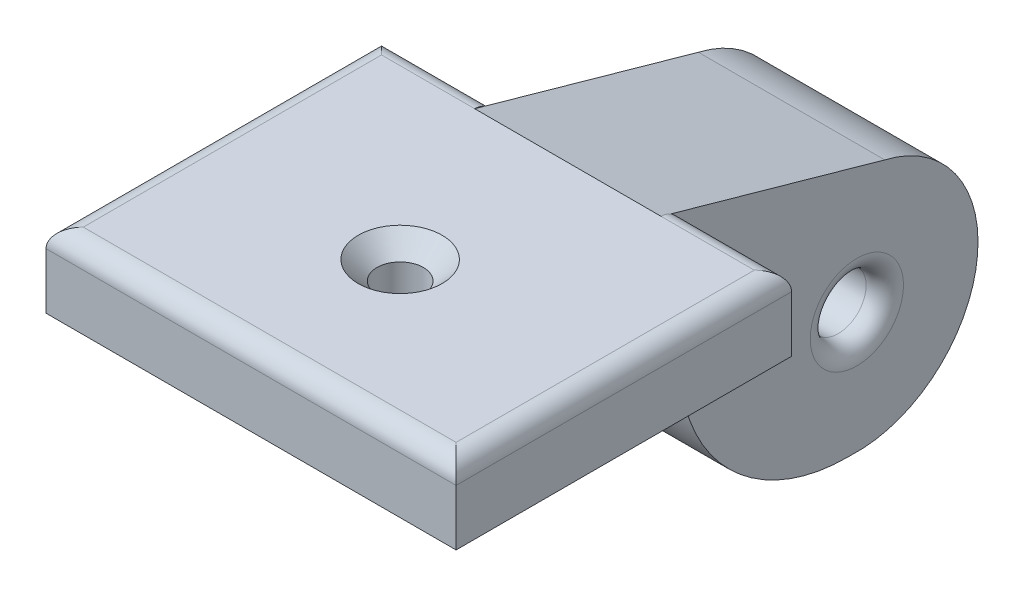
ISO-10303-21;
HEADER;
FILE_DESCRIPTION(('STEP AP214'),'2;1');
FILE_NAME('part.step','',(''),(''),'','','');
FILE_SCHEMA(('AUTOMOTIVE_DESIGN { 1 0 10303 214 1 1 1 1 }'));
ENDSEC;
DATA;
#1=APPLICATION_CONTEXT('core data for automotive mechanical design processes');
#2=APPLICATION_PROTOCOL_DEFINITION('international standard','automotive_design',2000,#1);
#3=PRODUCT_CONTEXT('',#1,'mechanical');
#4=PRODUCT('Part','Part','',(#3));
#5=PRODUCT_RELATED_PRODUCT_CATEGORY('part','',(#4));
#6=PRODUCT_DEFINITION_FORMATION('','',#4);
#7=PRODUCT_DEFINITION_CONTEXT('part definition',#1,'design');
#8=PRODUCT_DEFINITION('design','',#6,#7);
#9=PRODUCT_DEFINITION_SHAPE('','',#8);
#10=(LENGTH_UNIT() NAMED_UNIT(*) SI_UNIT(.MILLI.,.METRE.));
#11=(NAMED_UNIT(*) PLANE_ANGLE_UNIT() SI_UNIT($,.RADIAN.));
#12=(NAMED_UNIT(*) SI_UNIT($,.STERADIAN.) SOLID_ANGLE_UNIT());
#13=UNCERTAINTY_MEASURE_WITH_UNIT(LENGTH_MEASURE(1.E-05),#10,'distance_accuracy_value','');
#14=(GEOMETRIC_REPRESENTATION_CONTEXT(3) GLOBAL_UNCERTAINTY_ASSIGNED_CONTEXT((#13)) GLOBAL_UNIT_ASSIGNED_CONTEXT((#10,
#11,#12)) REPRESENTATION_CONTEXT('',''));
#15=CARTESIAN_POINT('',(0.,0.,0.));
#16=DIRECTION('',(0.,0.,1.));
#17=DIRECTION('',(1.,0.,0.));
#18=AXIS2_PLACEMENT_3D('',#15,#16,#17);
#19=CARTESIAN_POINT('',(0.,0.,0.));
#20=DIRECTION('',(0.,1.,0.));
#21=DIRECTION('',(0.,0.,1.));
#22=AXIS2_PLACEMENT_3D('',#19,#20,#21);
#23=PLANE('',#22);
#24=CARTESIAN_POINT('',(-8.24087591240878,0.,-15.3576642335766));
#25=DIRECTION('',(0.,1.,0.));
#26=DIRECTION('',(0.,0.,1.));
#27=AXIS2_PLACEMENT_3D('',#24,#25,#26);
#28=CIRCLE('',#27,1.2484307583388);
#29=CARTESIAN_POINT('',(-8.24087591240878,0.,-14.1092334752378));
#30=VERTEX_POINT('',#29);
#31=EDGE_CURVE('E289',#30,#30,#28,.T.);
#32=ORIENTED_EDGE('',*,*,#31,.T.);
#33=EDGE_LOOP('',(#32));
#34=FACE_BOUND('',#33,.T.);
#35=DIRECTION('',(1.,0.,0.));
#36=VECTOR('',#35,1.);
#37=CARTESIAN_POINT('',(0.,0.,-23.3576642335766));
#38=LINE('',#37,#36);
#39=CARTESIAN_POINT('',(-13.2408759124088,0.,-23.3576642335766));
#40=VERTEX_POINT('',#39);
#41=CARTESIAN_POINT('',(-3.24087591240879,0.,-23.3576642335766));
#42=VERTEX_POINT('',#41);
#43=EDGE_CURVE('E293',#40,#42,#38,.T.);
#44=ORIENTED_EDGE('',*,*,#43,.T.);
#45=DIRECTION('',(0.,0.,-1.));
#46=VECTOR('',#45,1.);
#47=CARTESIAN_POINT('',(-3.24087591240878,0.,0.));
#48=LINE('',#47,#46);
#49=CARTESIAN_POINT('',(-3.24087591240879,0.,-25.3576642335766));
#50=VERTEX_POINT('',#49);
#51=EDGE_CURVE('E297',#42,#50,#48,.T.);
#52=ORIENTED_EDGE('',*,*,#51,.T.);
#53=DIRECTION('',(1.,0.,0.));
#54=VECTOR('',#53,1.);
#55=CARTESIAN_POINT('',(0.,0.,-25.3576642335766));
#56=LINE('',#55,#54);
#57=CARTESIAN_POINT('',(2.75912408759122,0.,-25.3576642335766));
#58=VERTEX_POINT('',#57);
#59=EDGE_CURVE('E198',#50,#58,#56,.T.);
#60=ORIENTED_EDGE('',*,*,#59,.T.);
#61=DIRECTION('',(0.,0.,1.));
#62=VECTOR('',#61,1.);
#63=CARTESIAN_POINT('',(2.75912408759122,0.,0.));
#64=LINE('',#63,#62);
#65=CARTESIAN_POINT('',(2.75912408759122,0.,-7.35766423357664));
#66=VERTEX_POINT('',#65);
#67=EDGE_CURVE('E180',#58,#66,#64,.T.);
#68=ORIENTED_EDGE('',*,*,#67,.T.);
#69=DIRECTION('',(1.,0.,0.));
#70=VECTOR('',#69,1.);
#71=CARTESIAN_POINT('',(0.,0.,-7.35766423357664));
#72=LINE('',#71,#70);
#73=CARTESIAN_POINT('',(-19.2408759124088,0.,-7.35766423357664));
#74=VERTEX_POINT('',#73);
#75=EDGE_CURVE('E202',#74,#66,#72,.T.);
#76=ORIENTED_EDGE('',*,*,#75,.F.);
#77=DIRECTION('',(0.,0.,1.));
#78=VECTOR('',#77,1.);
#79=CARTESIAN_POINT('',(-19.2408759124088,0.,0.));
#80=LINE('',#79,#78);
#81=CARTESIAN_POINT('',(-19.2408759124088,0.,-25.3576642335766));
#82=VERTEX_POINT('',#81);
#83=EDGE_CURVE('E415',#82,#74,#80,.T.);
#84=ORIENTED_EDGE('',*,*,#83,.F.);
#85=DIRECTION('',(-1.,0.,0.));
#86=VECTOR('',#85,1.);
#87=CARTESIAN_POINT('',(-16.4817518248176,0.,-25.3576642335766));
#88=LINE('',#87,#86);
#89=CARTESIAN_POINT('',(-13.2408759124088,0.,-25.3576642335766));
#90=VERTEX_POINT('',#89);
#91=EDGE_CURVE('E420',#90,#82,#88,.T.);
#92=ORIENTED_EDGE('',*,*,#91,.F.);
#93=DIRECTION('',(0.,0.,1.));
#94=VECTOR('',#93,1.);
#95=CARTESIAN_POINT('',(-13.2408759124088,0.,0.));
#96=LINE('',#95,#94);
#97=EDGE_CURVE('E273',#90,#40,#96,.T.);
#98=ORIENTED_EDGE('',*,*,#97,.T.);
#99=EDGE_LOOP('',(#44,#52,#60,#68,#76,#84,#92,#98));
#100=FACE_BOUND('',#99,.T.);
#101=ADVANCED_FACE('F43',(#34,#100),#23,.F.);
#102=CARTESIAN_POINT('',(2.75912408759122,4.,0.));
#103=DIRECTION('',(1.,0.,0.));
#104=DIRECTION('',(0.,0.,-1.));
#105=AXIS2_PLACEMENT_3D('',#102,#103,#104);
#106=PLANE('',#105);
#107=DIRECTION('',(0.,-1.,0.));
#108=VECTOR('',#107,1.);
#109=CARTESIAN_POINT('',(2.75912408759122,4.,-25.3576642335766));
#110=LINE('',#109,#108);
#111=CARTESIAN_POINT('',(2.75912408759122,3.,-25.3576642335766));
#112=VERTEX_POINT('',#111);
#113=EDGE_CURVE('E213',#112,#58,#110,.T.);
#114=ORIENTED_EDGE('',*,*,#113,.F.);
#115=DIRECTION('',(0.,0.,1.));
#116=VECTOR('',#115,1.);
#117=CARTESIAN_POINT('',(2.75912408759122,3.,0.));
#118=LINE('',#117,#116);
#119=CARTESIAN_POINT('',(2.75912408759122,3.,-7.35766423357664));
#120=VERTEX_POINT('',#119);
#121=EDGE_CURVE('E236',#112,#120,#118,.T.);
#122=ORIENTED_EDGE('',*,*,#121,.T.);
#123=DIRECTION('',(0.,-1.,0.));
#124=VECTOR('',#123,1.);
#125=CARTESIAN_POINT('',(2.75912408759122,4.,-7.35766423357664));
#126=LINE('',#125,#124);
#127=EDGE_CURVE('E206',#120,#66,#126,.T.);
#128=ORIENTED_EDGE('',*,*,#127,.T.);
#129=ORIENTED_EDGE('',*,*,#67,.F.);
#130=EDGE_LOOP('',(#114,#122,#128,#129));
#131=FACE_BOUND('',#130,.T.);
#132=ADVANCED_FACE('F337',(#131),#106,.T.);
#133=CARTESIAN_POINT('',(0.,4.,-25.3576642335766));
#134=DIRECTION('',(0.,0.,-1.));
#135=DIRECTION('',(-1.,0.,0.));
#136=AXIS2_PLACEMENT_3D('',#133,#134,#135);
#137=PLANE('',#136);
#138=DIRECTION('',(0.,-1.,0.));
#139=VECTOR('',#138,1.);
#140=CARTESIAN_POINT('',(-3.24087591240879,4.,-25.3576642335766));
#141=LINE('',#140,#139);
#142=CARTESIAN_POINT('',(-3.24087591240879,3.,-25.3576642335766));
#143=VERTEX_POINT('',#142);
#144=EDGE_CURVE('E209',#143,#50,#141,.T.);
#145=ORIENTED_EDGE('',*,*,#144,.F.);
#146=DIRECTION('',(1.,0.,0.));
#147=VECTOR('',#146,1.);
#148=CARTESIAN_POINT('',(0.,3.,-25.3576642335766));
#149=LINE('',#148,#147);
#150=EDGE_CURVE('E216',#143,#112,#149,.T.);
#151=ORIENTED_EDGE('',*,*,#150,.T.);
#152=ORIENTED_EDGE('',*,*,#113,.T.);
#153=ORIENTED_EDGE('',*,*,#59,.F.);
#154=EDGE_LOOP('',(#145,#151,#152,#153));
#155=FACE_BOUND('',#154,.T.);
#156=ADVANCED_FACE('F343',(#155),#137,.T.);
#157=CARTESIAN_POINT('',(-3.24087591240878,4.,0.));
#158=DIRECTION('',(-1.,0.,0.));
#159=DIRECTION('',(0.,0.,1.));
#160=AXIS2_PLACEMENT_3D('',#157,#158,#159);
#161=PLANE('',#160);
#162=CARTESIAN_POINT('',(-3.24087591240879,-5.7,-34.8576642335766));
#163=DIRECTION('',(-1.,0.,0.));
#164=DIRECTION('',(0.,0.,1.));
#165=AXIS2_PLACEMENT_3D('',#162,#163,#164);
#166=CIRCLE('',#165,2.5);
#167=CARTESIAN_POINT('',(-3.24087591240879,-5.7,-32.3576642335766));
#168=VERTEX_POINT('',#167);
#169=EDGE_CURVE('E260',#168,#168,#166,.T.);
#170=ORIENTED_EDGE('',*,*,#169,.T.);
#171=EDGE_LOOP('',(#170));
#172=FACE_BOUND('',#171,.T.);
#173=CARTESIAN_POINT('',(-3.24087591240879,-5.7,-34.8576642335766));
#174=DIRECTION('',(1.,0.,0.));
#175=DIRECTION('',(0.,0.,-1.));
#176=AXIS2_PLACEMENT_3D('',#173,#174,#175);
#177=CIRCLE('',#176,6.5);
#178=CARTESIAN_POINT('',(-3.24087591240879,-12.1921305013964,-34.5379119031099));
#179=VERTEX_POINT('',#178);
#180=CARTESIAN_POINT('',(-3.24087591240879,0.624555320336759,-36.3576642335766));
#181=VERTEX_POINT('',#180);
#182=EDGE_CURVE('E176',#179,#181,#177,.T.);
#183=ORIENTED_EDGE('',*,*,#182,.T.);
#184=DIRECTION('',(0.,0.270778634132189,0.962641642199997));
#185=VECTOR('',#184,1.);
#186=CARTESIAN_POINT('',(-3.24087591240879,0.624555320336759,-36.3576642335766));
#187=LINE('',#186,#185);
#188=CARTESIAN_POINT('',(-3.24087591240879,3.85335786259501,-24.878989811644));
#189=VERTEX_POINT('',#188);
#190=EDGE_CURVE('E158',#181,#189,#187,.T.);
#191=ORIENTED_EDGE('',*,*,#190,.T.);
#192=CARTESIAN_POINT('',(-3.24087591240879,3.,-24.3576642335766));
#193=DIRECTION('',(-1.,0.,0.));
#194=DIRECTION('',(0.,0.,1.));
#195=AXIS2_PLACEMENT_3D('',#192,#193,#194);
#196=CIRCLE('',#195,1.);
#197=EDGE_CURVE('E264',#189,#143,#196,.T.);
#198=ORIENTED_EDGE('',*,*,#197,.T.);
#199=ORIENTED_EDGE('',*,*,#144,.T.);
#200=ORIENTED_EDGE('',*,*,#51,.F.);
#201=CARTESIAN_POINT('',(-3.24087591240879,-2.,-23.3576642335766));
#202=DIRECTION('',(-1.,0.,0.));
#203=DIRECTION('',(0.,0.,1.));
#204=AXIS2_PLACEMENT_3D('',#201,#202,#203);
#205=CIRCLE('',#204,2.);
#206=CARTESIAN_POINT('',(-3.24087591240879,-2.,-25.3576642335766));
#207=VERTEX_POINT('',#206);
#208=EDGE_CURVE('E303',#42,#207,#205,.T.);
#209=ORIENTED_EDGE('',*,*,#208,.T.);
#210=DIRECTION('',(0.,-1.,0.));
#211=VECTOR('',#210,1.);
#212=CARTESIAN_POINT('',(-3.24087591240879,0.,-25.3576642335766));
#213=LINE('',#212,#211);
#214=CARTESIAN_POINT('',(-3.24087591240879,-3.19213050139637,-25.3576642335766));
#215=VERTEX_POINT('',#214);
#216=EDGE_CURVE('E191',#207,#215,#213,.T.);
#217=ORIENTED_EDGE('',*,*,#216,.T.);
#218=CARTESIAN_POINT('',(-3.24087591240879,-3.19213050139637,-34.3576642335766));
#219=DIRECTION('',(-1.,0.,0.));
#220=DIRECTION('',(0.,0.,1.));
#221=AXIS2_PLACEMENT_3D('',#218,#219,#220);
#222=CIRCLE('',#221,9.);
#223=CARTESIAN_POINT('',(-3.24087591240879,-12.1921305013964,-34.3576642335766));
#224=VERTEX_POINT('',#223);
#225=EDGE_CURVE('E68',#215,#224,#222,.F.);
#226=ORIENTED_EDGE('',*,*,#225,.T.);
#227=DIRECTION('',(0.,0.,-1.));
#228=VECTOR('',#227,1.);
#229=CARTESIAN_POINT('',(-3.24087591240878,-12.1921305013964,0.));
#230=LINE('',#229,#228);
#231=EDGE_CURVE('E184',#224,#179,#230,.T.);
#232=ORIENTED_EDGE('',*,*,#231,.T.);
#233=EDGE_LOOP('',(#183,#191,#198,#199,#200,#209,#217,#226,#232));
#234=FACE_BOUND('',#233,.T.);
#235=ADVANCED_FACE('F183',(#172,#234),#161,.F.);
#236=CARTESIAN_POINT('',(0.,4.,-7.35766423357664));
#237=DIRECTION('',(0.,0.,-1.));
#238=DIRECTION('',(-1.,0.,0.));
#239=AXIS2_PLACEMENT_3D('',#236,#237,#238);
#240=PLANE('',#239);
#241=ORIENTED_EDGE('',*,*,#127,.F.);
#242=DIRECTION('',(1.,0.,0.));
#243=VECTOR('',#242,1.);
#244=CARTESIAN_POINT('',(-19.2408759124088,3.,-7.35766423357664));
#245=LINE('',#244,#243);
#246=CARTESIAN_POINT('',(-19.2408759124088,3.,-7.35766423357664));
#247=VERTEX_POINT('',#246);
#248=EDGE_CURVE('E239',#120,#247,#245,.F.);
#249=ORIENTED_EDGE('',*,*,#248,.T.);
#250=DIRECTION('',(0.,-1.,0.));
#251=VECTOR('',#250,1.);
#252=CARTESIAN_POINT('',(-19.2408759124088,4.,-7.35766423357664));
#253=LINE('',#252,#251);
#254=EDGE_CURVE('E435',#247,#74,#253,.T.);
#255=ORIENTED_EDGE('',*,*,#254,.T.);
#256=ORIENTED_EDGE('',*,*,#75,.T.);
#257=EDGE_LOOP('',(#241,#249,#255,#256));
#258=FACE_BOUND('',#257,.T.);
#259=ADVANCED_FACE('F352',(#258),#240,.F.);
#260=CARTESIAN_POINT('',(0.,4.,0.));
#261=DIRECTION('',(0.,1.,0.));
#262=DIRECTION('',(0.,0.,1.));
#263=AXIS2_PLACEMENT_3D('',#260,#261,#262);
#264=PLANE('',#263);
#265=CARTESIAN_POINT('',(-8.24087591240878,4.,-15.3576642335766));
#266=DIRECTION('',(0.,1.,0.));
#267=DIRECTION('',(0.,0.,1.));
#268=AXIS2_PLACEMENT_3D('',#265,#266,#267);
#269=CIRCLE('',#268,2.2484307583388);
#270=CARTESIAN_POINT('',(-8.24087591240878,4.,-13.1092334752378));
#271=VERTEX_POINT('',#270);
#272=EDGE_CURVE('E11',#271,#271,#269,.F.);
#273=ORIENTED_EDGE('',*,*,#272,.T.);
#274=EDGE_LOOP('',(#273));
#275=FACE_BOUND('',#274,.T.);
#276=DIRECTION('',(-1.,0.,0.));
#277=VECTOR('',#276,1.);
#278=CARTESIAN_POINT('',(-3.24087591240879,4.,-24.3576642335766));
#279=LINE('',#278,#277);
#280=CARTESIAN_POINT('',(-3.24087591240879,4.,-24.3576642335766));
#281=VERTEX_POINT('',#280);
#282=CARTESIAN_POINT('',(-13.2408759124088,4.,-24.3576642335766));
#283=VERTEX_POINT('',#282);
#284=EDGE_CURVE('E169',#281,#283,#279,.T.);
#285=ORIENTED_EDGE('',*,*,#284,.T.);
#286=DIRECTION('',(-1.,0.,0.));
#287=VECTOR('',#286,1.);
#288=CARTESIAN_POINT('',(-19.2408759124088,4.,-24.3576642335766));
#289=LINE('',#288,#287);
#290=CARTESIAN_POINT('',(-18.2408759124088,4.,-24.3576642335766));
#291=VERTEX_POINT('',#290);
#292=EDGE_CURVE('E223',#283,#291,#289,.T.);
#293=ORIENTED_EDGE('',*,*,#292,.T.);
#294=DIRECTION('',(0.,0.,1.));
#295=VECTOR('',#294,1.);
#296=CARTESIAN_POINT('',(-18.2408759124088,4.,-7.35766423357664));
#297=LINE('',#296,#295);
#298=CARTESIAN_POINT('',(-18.2408759124088,4.,-8.35766423357664));
#299=VERTEX_POINT('',#298);
#300=EDGE_CURVE('E220',#291,#299,#297,.T.);
#301=ORIENTED_EDGE('',*,*,#300,.T.);
#302=DIRECTION('',(1.,0.,0.));
#303=VECTOR('',#302,1.);
#304=CARTESIAN_POINT('',(2.75912408759122,4.,-8.35766423357664));
#305=LINE('',#304,#303);
#306=CARTESIAN_POINT('',(1.75912408759122,4.,-8.35766423357664));
#307=VERTEX_POINT('',#306);
#308=EDGE_CURVE('E226',#299,#307,#305,.T.);
#309=ORIENTED_EDGE('',*,*,#308,.T.);
#310=DIRECTION('',(0.,0.,1.));
#311=VECTOR('',#310,1.);
#312=CARTESIAN_POINT('',(1.75912408759122,4.,0.));
#313=LINE('',#312,#311);
#314=CARTESIAN_POINT('',(1.75912408759122,4.,-24.3576642335766));
#315=VERTEX_POINT('',#314);
#316=EDGE_CURVE('E229',#307,#315,#313,.F.);
#317=ORIENTED_EDGE('',*,*,#316,.T.);
#318=DIRECTION('',(1.,0.,0.));
#319=VECTOR('',#318,1.);
#320=CARTESIAN_POINT('',(0.,4.,-24.3576642335766));
#321=LINE('',#320,#319);
#322=EDGE_CURVE('E232',#315,#281,#321,.F.);
#323=ORIENTED_EDGE('',*,*,#322,.T.);
#324=EDGE_LOOP('',(#285,#293,#301,#309,#317,#323));
#325=FACE_BOUND('',#324,.T.);
#326=ADVANCED_FACE('F350',(#275,#325),#264,.T.);
#327=CARTESIAN_POINT('',(-8.24087591240879,-5.7,-34.8576642335766));
#328=DIRECTION('',(1.,0.,0.));
#329=DIRECTION('',(0.,0.,-1.));
#330=AXIS2_PLACEMENT_3D('',#327,#328,#329);
#331=CYLINDRICAL_SURFACE('',#330,6.5);
#332=ORIENTED_EDGE('',*,*,#182,.F.);
#333=DIRECTION('',(1.,0.,0.));
#334=VECTOR('',#333,1.);
#335=CARTESIAN_POINT('',(-8.24087591240879,-12.1921305013964,-34.5379119031099));
#336=LINE('',#335,#334);
#337=CARTESIAN_POINT('',(-13.2408759124088,-12.1921305013964,-34.5379119031099));
#338=VERTEX_POINT('',#337);
#339=EDGE_CURVE('E181',#338,#179,#336,.T.);
#340=ORIENTED_EDGE('',*,*,#339,.F.);
#341=CARTESIAN_POINT('',(-13.2408759124088,-5.7,-34.8576642335766));
#342=DIRECTION('',(1.,0.,0.));
#343=DIRECTION('',(0.,0.,-1.));
#344=AXIS2_PLACEMENT_3D('',#341,#342,#343);
#345=CIRCLE('',#344,6.5);
#346=CARTESIAN_POINT('',(-13.2408759124088,0.624555320336759,-36.3576642335766));
#347=VERTEX_POINT('',#346);
#348=EDGE_CURVE('E178',#338,#347,#345,.T.);
#349=ORIENTED_EDGE('',*,*,#348,.T.);
#350=DIRECTION('',(1.,0.,0.));
#351=VECTOR('',#350,1.);
#352=CARTESIAN_POINT('',(-8.24087591240879,0.624555320336759,-36.3576642335766));
#353=LINE('',#352,#351);
#354=EDGE_CURVE('E162',#347,#181,#353,.T.);
#355=ORIENTED_EDGE('',*,*,#354,.T.);
#356=EDGE_LOOP('',(#332,#340,#349,#355));
#357=FACE_BOUND('',#356,.T.);
#358=ADVANCED_FACE('F174',(#357),#331,.T.);
#359=CARTESIAN_POINT('',(-8.24087591240879,-12.1921305013964,0.));
#360=DIRECTION('',(0.,-1.,0.));
#361=DIRECTION('',(0.,0.,-1.));
#362=AXIS2_PLACEMENT_3D('',#359,#360,#361);
#363=PLANE('',#362);
#364=ORIENTED_EDGE('',*,*,#231,.F.);
#365=DIRECTION('',(1.,0.,0.));
#366=VECTOR('',#365,1.);
#367=CARTESIAN_POINT('',(-8.24087591240879,-12.1921305013964,-34.3576642335766));
#368=LINE('',#367,#366);
#369=CARTESIAN_POINT('',(-13.2408759124088,-12.1921305013964,-34.3576642335766));
#370=VERTEX_POINT('',#369);
#371=EDGE_CURVE('E60',#224,#370,#368,.F.);
#372=ORIENTED_EDGE('',*,*,#371,.T.);
#373=DIRECTION('',(0.,0.,-1.));
#374=VECTOR('',#373,1.);
#375=CARTESIAN_POINT('',(-13.2408759124088,-12.1921305013964,0.));
#376=LINE('',#375,#374);
#377=EDGE_CURVE('E409',#370,#338,#376,.T.);
#378=ORIENTED_EDGE('',*,*,#377,.T.);
#379=ORIENTED_EDGE('',*,*,#339,.T.);
#380=EDGE_LOOP('',(#364,#372,#378,#379));
#381=FACE_BOUND('',#380,.T.);
#382=ADVANCED_FACE('F488',(#381),#363,.T.);
#383=CARTESIAN_POINT('',(-8.24087591240879,0.,-25.3576642335766));
#384=DIRECTION('',(0.,0.,1.));
#385=DIRECTION('',(1.,0.,0.));
#386=AXIS2_PLACEMENT_3D('',#383,#384,#385);
#387=PLANE('',#386);
#388=DIRECTION('',(0.,-1.,0.));
#389=VECTOR('',#388,1.);
#390=CARTESIAN_POINT('',(-13.2408759124088,0.,-25.3576642335766));
#391=LINE('',#390,#389);
#392=CARTESIAN_POINT('',(-13.2408759124088,-2.,-25.3576642335766));
#393=VERTEX_POINT('',#392);
#394=CARTESIAN_POINT('',(-13.2408759124088,-3.19213050139637,-25.3576642335766));
#395=VERTEX_POINT('',#394);
#396=EDGE_CURVE('E407',#393,#395,#391,.T.);
#397=ORIENTED_EDGE('',*,*,#396,.T.);
#398=DIRECTION('',(1.,0.,0.));
#399=VECTOR('',#398,1.);
#400=CARTESIAN_POINT('',(-8.24087591240879,-3.19213050139637,-25.3576642335766));
#401=LINE('',#400,#399);
#402=EDGE_CURVE('E309',#395,#215,#401,.T.);
#403=ORIENTED_EDGE('',*,*,#402,.T.);
#404=ORIENTED_EDGE('',*,*,#216,.F.);
#405=DIRECTION('',(1.,0.,0.));
#406=VECTOR('',#405,1.);
#407=CARTESIAN_POINT('',(-8.24087591240879,-2.,-25.3576642335766));
#408=LINE('',#407,#406);
#409=EDGE_CURVE('E300',#207,#393,#408,.F.);
#410=ORIENTED_EDGE('',*,*,#409,.T.);
#411=EDGE_LOOP('',(#397,#403,#404,#410));
#412=FACE_BOUND('',#411,.T.);
#413=ADVANCED_FACE('F411',(#412),#387,.T.);
#414=CARTESIAN_POINT('',(-8.24087591240879,-5.7,-34.8576642335766));
#415=DIRECTION('',(1.,0.,0.));
#416=DIRECTION('',(0.,0.,-1.));
#417=AXIS2_PLACEMENT_3D('',#414,#415,#416);
#418=CYLINDRICAL_SURFACE('',#417,1.5);
#419=CARTESIAN_POINT('',(-12.2408759124088,-5.7,-34.8576642335766));
#420=DIRECTION('',(-1.,0.,0.));
#421=DIRECTION('',(0.,0.,1.));
#422=AXIS2_PLACEMENT_3D('',#419,#420,#421);
#423=CIRCLE('',#422,1.5);
#424=CARTESIAN_POINT('',(-12.2408759124088,-5.7,-33.3576642335766));
#425=VERTEX_POINT('',#424);
#426=EDGE_CURVE('E256',#425,#425,#423,.T.);
#427=ORIENTED_EDGE('',*,*,#426,.T.);
#428=EDGE_LOOP('',(#427));
#429=FACE_BOUND('',#428,.T.);
#430=CARTESIAN_POINT('',(-4.24087591240879,-5.7,-34.8576642335766));
#431=DIRECTION('',(-1.,0.,0.));
#432=DIRECTION('',(0.,0.,1.));
#433=AXIS2_PLACEMENT_3D('',#430,#431,#432);
#434=CIRCLE('',#433,1.5);
#435=CARTESIAN_POINT('',(-4.24087591240879,-5.7,-33.3576642335766));
#436=VERTEX_POINT('',#435);
#437=EDGE_CURVE('E252',#436,#436,#434,.F.);
#438=ORIENTED_EDGE('',*,*,#437,.T.);
#439=EDGE_LOOP('',(#438));
#440=FACE_BOUND('',#439,.T.);
#441=ADVANCED_FACE('F476',(#429,#440),#418,.F.);
#442=CARTESIAN_POINT('',(-19.2408759124088,4.,0.));
#443=DIRECTION('',(1.,0.,0.));
#444=DIRECTION('',(0.,0.,-1.));
#445=AXIS2_PLACEMENT_3D('',#442,#443,#444);
#446=PLANE('',#445);
#447=ORIENTED_EDGE('',*,*,#254,.F.);
#448=DIRECTION('',(0.,0.,1.));
#449=VECTOR('',#448,1.);
#450=CARTESIAN_POINT('',(-19.2408759124088,3.,-25.3576642335766));
#451=LINE('',#450,#449);
#452=CARTESIAN_POINT('',(-19.2408759124088,3.,-25.3576642335766));
#453=VERTEX_POINT('',#452);
#454=EDGE_CURVE('E245',#247,#453,#451,.F.);
#455=ORIENTED_EDGE('',*,*,#454,.T.);
#456=DIRECTION('',(0.,-1.,0.));
#457=VECTOR('',#456,1.);
#458=CARTESIAN_POINT('',(-19.2408759124088,4.,-25.3576642335766));
#459=LINE('',#458,#457);
#460=EDGE_CURVE('E428',#453,#82,#459,.T.);
#461=ORIENTED_EDGE('',*,*,#460,.T.);
#462=ORIENTED_EDGE('',*,*,#83,.T.);
#463=EDGE_LOOP('',(#447,#455,#461,#462));
#464=FACE_BOUND('',#463,.T.);
#465=ADVANCED_FACE('F474',(#464),#446,.F.);
#466=CARTESIAN_POINT('',(-13.2408759124088,4.,0.));
#467=DIRECTION('',(-1.,0.,0.));
#468=DIRECTION('',(0.,0.,1.));
#469=AXIS2_PLACEMENT_3D('',#466,#467,#468);
#470=PLANE('',#469);
#471=DIRECTION('',(0.,0.270778634132189,0.962641642199997));
#472=VECTOR('',#471,1.);
#473=CARTESIAN_POINT('',(-13.2408759124088,0.624555320336759,-36.3576642335766));
#474=LINE('',#473,#472);
#475=CARTESIAN_POINT('',(-13.2408759124088,3.85335786259501,-24.878989811644));
#476=VERTEX_POINT('',#475);
#477=EDGE_CURVE('E697',#347,#476,#474,.T.);
#478=ORIENTED_EDGE('',*,*,#477,.F.);
#479=ORIENTED_EDGE('',*,*,#348,.F.);
#480=ORIENTED_EDGE('',*,*,#377,.F.);
#481=CARTESIAN_POINT('',(-13.2408759124088,-3.19213050139637,-34.3576642335766));
#482=DIRECTION('',(-1.,0.,0.));
#483=DIRECTION('',(0.,0.,1.));
#484=AXIS2_PLACEMENT_3D('',#481,#482,#483);
#485=CIRCLE('',#484,9.);
#486=EDGE_CURVE('E317',#370,#395,#485,.T.);
#487=ORIENTED_EDGE('',*,*,#486,.T.);
#488=ORIENTED_EDGE('',*,*,#396,.F.);
#489=CARTESIAN_POINT('',(-13.2408759124088,-2.,-23.3576642335766));
#490=DIRECTION('',(-1.,0.,0.));
#491=DIRECTION('',(0.,0.,1.));
#492=AXIS2_PLACEMENT_3D('',#489,#490,#491);
#493=CIRCLE('',#492,2.);
#494=EDGE_CURVE('E306',#393,#40,#493,.F.);
#495=ORIENTED_EDGE('',*,*,#494,.T.);
#496=ORIENTED_EDGE('',*,*,#97,.F.);
#497=DIRECTION('',(0.,-1.,0.));
#498=VECTOR('',#497,1.);
#499=CARTESIAN_POINT('',(-13.2408759124088,4.,-25.3576642335766));
#500=LINE('',#499,#498);
#501=CARTESIAN_POINT('',(-13.2408759124088,3.,-25.3576642335766));
#502=VERTEX_POINT('',#501);
#503=EDGE_CURVE('E431',#502,#90,#500,.T.);
#504=ORIENTED_EDGE('',*,*,#503,.F.);
#505=CARTESIAN_POINT('',(-13.2408759124088,3.,-24.3576642335766));
#506=DIRECTION('',(-1.,0.,0.));
#507=DIRECTION('',(0.,0.,1.));
#508=AXIS2_PLACEMENT_3D('',#505,#506,#507);
#509=CIRCLE('',#508,1.);
#510=EDGE_CURVE('E269',#502,#476,#509,.F.);
#511=ORIENTED_EDGE('',*,*,#510,.T.);
#512=EDGE_LOOP('',(#478,#479,#480,#487,#488,#495,#496,#504,#511));
#513=FACE_BOUND('',#512,.T.);
#514=CARTESIAN_POINT('',(-13.2408759124088,-5.7,-34.8576642335766));
#515=DIRECTION('',(-1.,0.,0.));
#516=DIRECTION('',(0.,0.,1.));
#517=AXIS2_PLACEMENT_3D('',#514,#515,#516);
#518=CIRCLE('',#517,2.5);
#519=CARTESIAN_POINT('',(-13.2408759124088,-5.7,-32.3576642335766));
#520=VERTEX_POINT('',#519);
#521=EDGE_CURVE('E248',#520,#520,#518,.F.);
#522=ORIENTED_EDGE('',*,*,#521,.T.);
#523=EDGE_LOOP('',(#522));
#524=FACE_BOUND('',#523,.T.);
#525=ADVANCED_FACE('F405',(#513,#524),#470,.T.);
#526=CARTESIAN_POINT('',(-16.4817518248176,4.,-25.3576642335766));
#527=DIRECTION('',(0.,0.,1.));
#528=DIRECTION('',(1.,0.,0.));
#529=AXIS2_PLACEMENT_3D('',#526,#527,#528);
#530=PLANE('',#529);
#531=ORIENTED_EDGE('',*,*,#460,.F.);
#532=DIRECTION('',(-1.,0.,0.));
#533=VECTOR('',#532,1.);
#534=CARTESIAN_POINT('',(-13.2408759124088,3.,-25.3576642335766));
#535=LINE('',#534,#533);
#536=EDGE_CURVE('E242',#453,#502,#535,.F.);
#537=ORIENTED_EDGE('',*,*,#536,.T.);
#538=ORIENTED_EDGE('',*,*,#503,.T.);
#539=ORIENTED_EDGE('',*,*,#91,.T.);
#540=EDGE_LOOP('',(#531,#537,#538,#539));
#541=FACE_BOUND('',#540,.T.);
#542=ADVANCED_FACE('F446',(#541),#530,.F.);
#543=CARTESIAN_POINT('',(-8.24087591240878,-1.,-15.3576642335766));
#544=DIRECTION('',(0.,1.,0.));
#545=DIRECTION('',(0.,0.,1.));
#546=AXIS2_PLACEMENT_3D('',#543,#544,#545);
#547=CYLINDRICAL_SURFACE('',#546,1.2484307583388);
#548=CARTESIAN_POINT('',(-8.24087591240878,3.,-15.3576642335766));
#549=DIRECTION('',(0.,1.,0.));
#550=DIRECTION('',(0.,0.,1.));
#551=AXIS2_PLACEMENT_3D('',#548,#549,#550);
#552=CIRCLE('',#551,1.2484307583388);
#553=CARTESIAN_POINT('',(-8.24087591240878,3.,-14.1092334752378));
#554=VERTEX_POINT('',#553);
#555=EDGE_CURVE('E53',#554,#554,#552,.T.);
#556=ORIENTED_EDGE('',*,*,#555,.T.);
#557=EDGE_LOOP('',(#556));
#558=FACE_BOUND('',#557,.T.);
#559=ORIENTED_EDGE('',*,*,#31,.F.);
#560=EDGE_LOOP('',(#559));
#561=FACE_BOUND('',#560,.T.);
#562=ADVANCED_FACE('F323',(#558,#561),#547,.F.);
#563=CARTESIAN_POINT('',(0.,3.,-24.3576642335766));
#564=DIRECTION('',(1.,0.,0.));
#565=DIRECTION('',(0.,0.,-1.));
#566=AXIS2_PLACEMENT_3D('',#563,#564,#565);
#567=CYLINDRICAL_SURFACE('',#566,1.);
#568=ORIENTED_EDGE('',*,*,#510,.F.);
#569=ORIENTED_EDGE('',*,*,#536,.F.);
#570=CARTESIAN_POINT('',(-18.2408759124088,3.,-24.3576642335766));
#571=DIRECTION('',(0.707106781186547,0.,-0.707106781186548));
#572=DIRECTION('',(-0.707106781186548,0.,-0.707106781186547));
#573=AXIS2_PLACEMENT_3D('',#570,#571,#572);
#574=ELLIPSE('',#573,1.41421356237309,1.);
#575=EDGE_CURVE('E285',#291,#453,#574,.F.);
#576=ORIENTED_EDGE('',*,*,#575,.F.);
#577=ORIENTED_EDGE('',*,*,#292,.F.);
#578=EDGE_CURVE('E268',#476,#283,#509,.F.);
#579=ORIENTED_EDGE('',*,*,#578,.F.);
#580=EDGE_LOOP('',(#568,#569,#576,#577,#579));
#581=FACE_BOUND('',#580,.T.);
#582=ADVANCED_FACE('F378',(#581),#567,.T.);
#583=CARTESIAN_POINT('',(-18.2408759124088,3.,0.));
#584=DIRECTION('',(0.,0.,-1.));
#585=DIRECTION('',(-1.,0.,0.));
#586=AXIS2_PLACEMENT_3D('',#583,#584,#585);
#587=CYLINDRICAL_SURFACE('',#586,1.);
#588=ORIENTED_EDGE('',*,*,#575,.T.);
#589=ORIENTED_EDGE('',*,*,#454,.F.);
#590=CARTESIAN_POINT('',(-18.2408759124088,3.,-8.35766423357664));
#591=DIRECTION('',(-0.707106781186548,0.,-0.707106781186547));
#592=DIRECTION('',(0.707106781186547,0.,-0.707106781186548));
#593=AXIS2_PLACEMENT_3D('',#590,#591,#592);
#594=ELLIPSE('',#593,1.41421356237309,1.);
#595=EDGE_CURVE('E281',#299,#247,#594,.F.);
#596=ORIENTED_EDGE('',*,*,#595,.F.);
#597=ORIENTED_EDGE('',*,*,#300,.F.);
#598=EDGE_LOOP('',(#588,#589,#596,#597));
#599=FACE_BOUND('',#598,.T.);
#600=ADVANCED_FACE('F374',(#599),#587,.T.);
#601=CARTESIAN_POINT('',(0.,3.,-8.35766423357664));
#602=DIRECTION('',(-1.,0.,0.));
#603=DIRECTION('',(0.,0.,1.));
#604=AXIS2_PLACEMENT_3D('',#601,#602,#603);
#605=CYLINDRICAL_SURFACE('',#604,1.);
#606=ORIENTED_EDGE('',*,*,#595,.T.);
#607=ORIENTED_EDGE('',*,*,#248,.F.);
#608=CARTESIAN_POINT('',(1.75912408759122,3.,-8.35766423357664));
#609=DIRECTION('',(-0.707106781186547,0.,0.707106781186547));
#610=DIRECTION('',(-0.707106781186547,0.,-0.707106781186547));
#611=AXIS2_PLACEMENT_3D('',#608,#609,#610);
#612=ELLIPSE('',#611,1.41421356237309,1.);
#613=EDGE_CURVE('E277',#307,#120,#612,.F.);
#614=ORIENTED_EDGE('',*,*,#613,.F.);
#615=ORIENTED_EDGE('',*,*,#308,.F.);
#616=EDGE_LOOP('',(#606,#607,#614,#615));
#617=FACE_BOUND('',#616,.T.);
#618=ADVANCED_FACE('F370',(#617),#605,.T.);
#619=CARTESIAN_POINT('',(1.75912408759122,3.,0.));
#620=DIRECTION('',(0.,0.,1.));
#621=DIRECTION('',(1.,0.,0.));
#622=AXIS2_PLACEMENT_3D('',#619,#620,#621);
#623=CYLINDRICAL_SURFACE('',#622,1.);
#624=ORIENTED_EDGE('',*,*,#613,.T.);
#625=ORIENTED_EDGE('',*,*,#121,.F.);
#626=CARTESIAN_POINT('',(1.75912408759122,3.,-24.3576642335766));
#627=DIRECTION('',(0.707106781186547,0.,0.707106781186547));
#628=DIRECTION('',(-0.707106781186547,0.,0.707106781186547));
#629=AXIS2_PLACEMENT_3D('',#626,#627,#628);
#630=ELLIPSE('',#629,1.41421356237309,1.);
#631=EDGE_CURVE('E274',#315,#112,#630,.F.);
#632=ORIENTED_EDGE('',*,*,#631,.F.);
#633=ORIENTED_EDGE('',*,*,#316,.F.);
#634=EDGE_LOOP('',(#624,#625,#632,#633));
#635=FACE_BOUND('',#634,.T.);
#636=ADVANCED_FACE('F366',(#635),#623,.T.);
#637=CARTESIAN_POINT('',(0.,3.,-24.3576642335766));
#638=DIRECTION('',(1.,0.,0.));
#639=DIRECTION('',(0.,0.,-1.));
#640=AXIS2_PLACEMENT_3D('',#637,#638,#639);
#641=CYLINDRICAL_SURFACE('',#640,1.);
#642=EDGE_CURVE('E265',#281,#189,#196,.T.);
#643=ORIENTED_EDGE('',*,*,#642,.F.);
#644=ORIENTED_EDGE('',*,*,#322,.F.);
#645=ORIENTED_EDGE('',*,*,#631,.T.);
#646=ORIENTED_EDGE('',*,*,#150,.F.);
#647=ORIENTED_EDGE('',*,*,#197,.F.);
#648=EDGE_LOOP('',(#643,#644,#645,#646,#647));
#649=FACE_BOUND('',#648,.T.);
#650=ADVANCED_FACE('F362',(#649),#641,.T.);
#651=CARTESIAN_POINT('',(-12.2408759124088,-5.7,-34.8576642335766));
#652=DIRECTION('',(-1.,0.,0.));
#653=DIRECTION('',(0.,0.,1.));
#654=AXIS2_PLACEMENT_3D('',#651,#652,#653);
#655=TOROIDAL_SURFACE('',#654,2.5,1.);
#656=ORIENTED_EDGE('',*,*,#426,.F.);
#657=EDGE_LOOP('',(#656));
#658=FACE_BOUND('',#657,.T.);
#659=ORIENTED_EDGE('',*,*,#521,.F.);
#660=EDGE_LOOP('',(#659));
#661=FACE_BOUND('',#660,.T.);
#662=ADVANCED_FACE('F365',(#658,#661),#655,.T.);
#663=CARTESIAN_POINT('',(-4.24087591240879,-5.7,-34.8576642335766));
#664=DIRECTION('',(-1.,0.,0.));
#665=DIRECTION('',(0.,0.,1.));
#666=AXIS2_PLACEMENT_3D('',#663,#664,#665);
#667=TOROIDAL_SURFACE('',#666,2.5,1.);
#668=ORIENTED_EDGE('',*,*,#169,.F.);
#669=EDGE_LOOP('',(#668));
#670=FACE_BOUND('',#669,.T.);
#671=ORIENTED_EDGE('',*,*,#437,.F.);
#672=EDGE_LOOP('',(#671));
#673=FACE_BOUND('',#672,.T.);
#674=ADVANCED_FACE('F385',(#670,#673),#667,.T.);
#675=CARTESIAN_POINT('',(0.,-2.,-23.3576642335766));
#676=DIRECTION('',(1.,0.,0.));
#677=DIRECTION('',(0.,0.,-1.));
#678=AXIS2_PLACEMENT_3D('',#675,#676,#677);
#679=CYLINDRICAL_SURFACE('',#678,2.);
#680=ORIENTED_EDGE('',*,*,#494,.F.);
#681=ORIENTED_EDGE('',*,*,#409,.F.);
#682=ORIENTED_EDGE('',*,*,#208,.F.);
#683=ORIENTED_EDGE('',*,*,#43,.F.);
#684=EDGE_LOOP('',(#680,#681,#682,#683));
#685=FACE_BOUND('',#684,.T.);
#686=ADVANCED_FACE('F389',(#685),#679,.F.);
#687=CARTESIAN_POINT('',(-8.24087591240879,-3.19213050139637,-34.3576642335766));
#688=DIRECTION('',(1.,0.,0.));
#689=DIRECTION('',(0.,0.,-1.));
#690=AXIS2_PLACEMENT_3D('',#687,#688,#689);
#691=CYLINDRICAL_SURFACE('',#690,9.);
#692=ORIENTED_EDGE('',*,*,#486,.F.);
#693=ORIENTED_EDGE('',*,*,#371,.F.);
#694=ORIENTED_EDGE('',*,*,#225,.F.);
#695=ORIENTED_EDGE('',*,*,#402,.F.);
#696=EDGE_LOOP('',(#692,#693,#694,#695));
#697=FACE_BOUND('',#696,.T.);
#698=ADVANCED_FACE('F392',(#697),#691,.T.);
#699=CARTESIAN_POINT('',(-3.24087591240879,0.624555320336759,-36.3576642335766));
#700=DIRECTION('',(0.,-0.962641642199997,0.270778634132189));
#701=DIRECTION('',(0.,-0.270778634132189,-0.962641642199997));
#702=AXIS2_PLACEMENT_3D('',#699,#700,#701);
#703=PLANE('',#702);
#704=ORIENTED_EDGE('',*,*,#477,.T.);
#705=EDGE_CURVE('E708',#476,#283,#474,.T.);
#706=ORIENTED_EDGE('',*,*,#705,.T.);
#707=ORIENTED_EDGE('',*,*,#284,.F.);
#708=EDGE_CURVE('E165',#189,#281,#187,.T.);
#709=ORIENTED_EDGE('',*,*,#708,.F.);
#710=ORIENTED_EDGE('',*,*,#190,.F.);
#711=ORIENTED_EDGE('',*,*,#354,.F.);
#712=EDGE_LOOP('',(#704,#706,#707,#709,#710,#711));
#713=FACE_BOUND('',#712,.T.);
#714=ADVANCED_FACE('F161',(#713),#703,.F.);
#715=CARTESIAN_POINT('',(-3.24087591240878,0.,0.));
#716=DIRECTION('',(1.,0.,0.));
#717=DIRECTION('',(0.,0.,-1.));
#718=AXIS2_PLACEMENT_3D('',#715,#716,#717);
#719=PLANE('',#718);
#720=ORIENTED_EDGE('',*,*,#642,.T.);
#721=ORIENTED_EDGE('',*,*,#708,.T.);
#722=EDGE_LOOP('',(#720,#721));
#723=FACE_BOUND('',#722,.T.);
#724=ADVANCED_FACE('F332',(#723),#719,.F.);
#725=CARTESIAN_POINT('',(-13.2408759124088,0.,0.));
#726=DIRECTION('',(1.,0.,0.));
#727=DIRECTION('',(0.,0.,-1.));
#728=AXIS2_PLACEMENT_3D('',#725,#726,#727);
#729=PLANE('',#728);
#730=ORIENTED_EDGE('',*,*,#705,.F.);
#731=ORIENTED_EDGE('',*,*,#578,.T.);
#732=EDGE_LOOP('',(#730,#731));
#733=FACE_BOUND('',#732,.T.);
#734=ADVANCED_FACE('F327',(#733),#729,.T.);
#735=CARTESIAN_POINT('',(-8.24087591240878,3.,-15.3576642335766));
#736=DIRECTION('',(0.,1.,0.));
#737=DIRECTION('',(0.,0.,1.));
#738=AXIS2_PLACEMENT_3D('',#735,#736,#737);
#739=CONICAL_SURFACE('',#738,1.2484307583388,0.785398163397449);
#740=ORIENTED_EDGE('',*,*,#272,.F.);
#741=EDGE_LOOP('',(#740));
#742=FACE_BOUND('',#741,.T.);
#743=ORIENTED_EDGE('',*,*,#555,.F.);
#744=EDGE_LOOP('',(#743));
#745=FACE_BOUND('',#744,.T.);
#746=ADVANCED_FACE('F46',(#742,#745),#739,.F.);
#747=CLOSED_SHELL('',(#101,#132,#156,#235,#259,#326,#358,#382,#413,#441,#465,#525,#542,#562,
#582,#600,#618,#636,#650,#662,#674,#686,#698,#714,#724,#734,#746));
#748=MANIFOLD_SOLID_BREP('B2',#747);
#749=ADVANCED_BREP_SHAPE_REPRESENTATION('',(#18,#748),#14);
#750=SHAPE_DEFINITION_REPRESENTATION(#9,#749);
ENDSEC;
END-ISO-10303-21;
